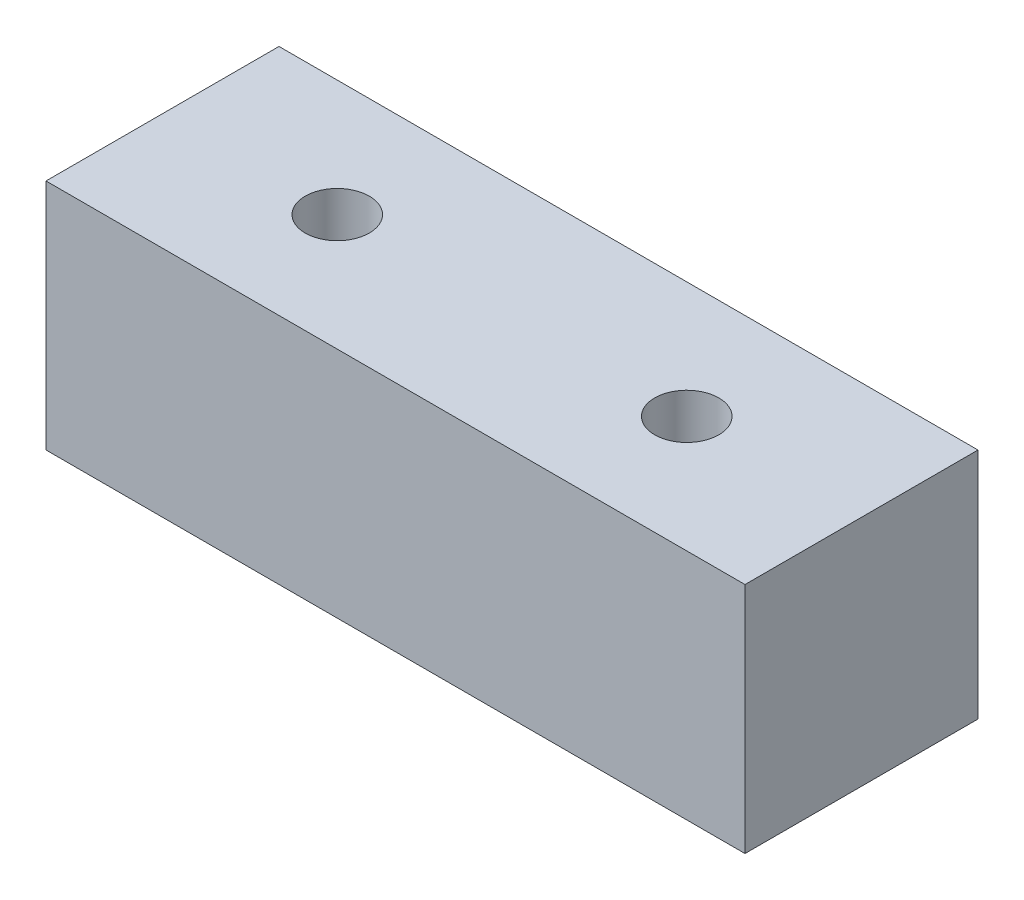
ISO-10303-21;
HEADER;
FILE_DESCRIPTION(('STEP AP214'),'2;1');
FILE_NAME('part.step','',(''),(''),'','','');
FILE_SCHEMA(('AUTOMOTIVE_DESIGN { 1 0 10303 214 1 1 1 1 }'));
ENDSEC;
DATA;
#1=APPLICATION_CONTEXT('core data for automotive mechanical design processes');
#2=APPLICATION_PROTOCOL_DEFINITION('international standard','automotive_design',2000,#1);
#3=PRODUCT_CONTEXT('',#1,'mechanical');
#4=PRODUCT('Part','Part','',(#3));
#5=PRODUCT_RELATED_PRODUCT_CATEGORY('part','',(#4));
#6=PRODUCT_DEFINITION_FORMATION('','',#4);
#7=PRODUCT_DEFINITION_CONTEXT('part definition',#1,'design');
#8=PRODUCT_DEFINITION('design','',#6,#7);
#9=PRODUCT_DEFINITION_SHAPE('','',#8);
#10=(LENGTH_UNIT() NAMED_UNIT(*) SI_UNIT(.MILLI.,.METRE.));
#11=(NAMED_UNIT(*) PLANE_ANGLE_UNIT() SI_UNIT($,.RADIAN.));
#12=(NAMED_UNIT(*) SI_UNIT($,.STERADIAN.) SOLID_ANGLE_UNIT());
#13=UNCERTAINTY_MEASURE_WITH_UNIT(LENGTH_MEASURE(1.E-05),#10,'distance_accuracy_value','');
#14=(GEOMETRIC_REPRESENTATION_CONTEXT(3) GLOBAL_UNCERTAINTY_ASSIGNED_CONTEXT((#13)) GLOBAL_UNIT_ASSIGNED_CONTEXT((#10,
#11,#12)) REPRESENTATION_CONTEXT('',''));
#15=CARTESIAN_POINT('',(0.,0.,0.));
#16=DIRECTION('',(0.,0.,1.));
#17=DIRECTION('',(1.,0.,0.));
#18=AXIS2_PLACEMENT_3D('',#15,#16,#17);
#19=CARTESIAN_POINT('',(30.,10.,10.));
#20=DIRECTION('',(0.,-1.,0.));
#21=DIRECTION('',(0.,0.,-1.));
#22=AXIS2_PLACEMENT_3D('',#19,#20,#21);
#23=PLANE('',#22);
#24=DIRECTION('',(0.,0.,1.));
#25=VECTOR('',#24,1.);
#26=CARTESIAN_POINT('',(-30.,10.,10.));
#27=LINE('',#26,#25);
#28=CARTESIAN_POINT('',(-30.,10.,-10.));
#29=VERTEX_POINT('',#28);
#30=CARTESIAN_POINT('',(-30.,10.,10.));
#31=VERTEX_POINT('',#30);
#32=EDGE_CURVE('E105',#29,#31,#27,.T.);
#33=ORIENTED_EDGE('',*,*,#32,.T.);
#34=DIRECTION('',(-1.,0.,0.));
#35=VECTOR('',#34,1.);
#36=CARTESIAN_POINT('',(30.,10.,10.));
#37=LINE('',#36,#35);
#38=CARTESIAN_POINT('',(30.,10.,10.));
#39=VERTEX_POINT('',#38);
#40=EDGE_CURVE('E58',#39,#31,#37,.T.);
#41=ORIENTED_EDGE('',*,*,#40,.F.);
#42=DIRECTION('',(0.,0.,1.));
#43=VECTOR('',#42,1.);
#44=CARTESIAN_POINT('',(30.,10.,10.));
#45=LINE('',#44,#43);
#46=CARTESIAN_POINT('',(30.,10.,-10.));
#47=VERTEX_POINT('',#46);
#48=EDGE_CURVE('E96',#47,#39,#45,.T.);
#49=ORIENTED_EDGE('',*,*,#48,.F.);
#50=DIRECTION('',(-1.,0.,0.));
#51=VECTOR('',#50,1.);
#52=CARTESIAN_POINT('',(30.,10.,-10.));
#53=LINE('',#52,#51);
#54=EDGE_CURVE('E13',#47,#29,#53,.T.);
#55=ORIENTED_EDGE('',*,*,#54,.T.);
#56=EDGE_LOOP('',(#33,#41,#49,#55));
#57=FACE_BOUND('',#56,.T.);
#58=CARTESIAN_POINT('',(15.,10.,0.));
#59=DIRECTION('',(0.,1.,0.));
#60=DIRECTION('',(0.,0.,1.));
#61=AXIS2_PLACEMENT_3D('',#58,#59,#60);
#62=CIRCLE('',#61,2.75);
#63=CARTESIAN_POINT('',(15.,10.,2.75));
#64=VERTEX_POINT('',#63);
#65=EDGE_CURVE('E128',#64,#64,#62,.T.);
#66=ORIENTED_EDGE('',*,*,#65,.F.);
#67=EDGE_LOOP('',(#66));
#68=FACE_BOUND('',#67,.T.);
#69=CARTESIAN_POINT('',(-15.,10.,0.));
#70=DIRECTION('',(0.,-1.,0.));
#71=DIRECTION('',(0.,0.,1.));
#72=AXIS2_PLACEMENT_3D('',#69,#70,#71);
#73=CIRCLE('',#72,2.75);
#74=CARTESIAN_POINT('',(-15.,10.,2.75));
#75=VERTEX_POINT('',#74);
#76=EDGE_CURVE('E134',#75,#75,#73,.T.);
#77=ORIENTED_EDGE('',*,*,#76,.T.);
#78=EDGE_LOOP('',(#77));
#79=FACE_BOUND('',#78,.T.);
#80=ADVANCED_FACE('F49',(#57,#68,#79),#23,.F.);
#81=CARTESIAN_POINT('',(30.,-10.,10.));
#82=DIRECTION('',(0.,1.,0.));
#83=DIRECTION('',(0.,0.,1.));
#84=AXIS2_PLACEMENT_3D('',#81,#82,#83);
#85=PLANE('',#84);
#86=DIRECTION('',(0.,0.,-1.));
#87=VECTOR('',#86,1.);
#88=CARTESIAN_POINT('',(-30.,-10.,10.));
#89=LINE('',#88,#87);
#90=CARTESIAN_POINT('',(-30.,-10.,10.));
#91=VERTEX_POINT('',#90);
#92=CARTESIAN_POINT('',(-30.,-10.,-10.));
#93=VERTEX_POINT('',#92);
#94=EDGE_CURVE('E89',#91,#93,#89,.T.);
#95=ORIENTED_EDGE('',*,*,#94,.T.);
#96=DIRECTION('',(-1.,0.,0.));
#97=VECTOR('',#96,1.);
#98=CARTESIAN_POINT('',(30.,-10.,-10.));
#99=LINE('',#98,#97);
#100=CARTESIAN_POINT('',(30.,-10.,-10.));
#101=VERTEX_POINT('',#100);
#102=EDGE_CURVE('E109',#101,#93,#99,.T.);
#103=ORIENTED_EDGE('',*,*,#102,.F.);
#104=DIRECTION('',(0.,0.,-1.));
#105=VECTOR('',#104,1.);
#106=CARTESIAN_POINT('',(30.,-10.,10.));
#107=LINE('',#106,#105);
#108=CARTESIAN_POINT('',(30.,-10.,10.));
#109=VERTEX_POINT('',#108);
#110=EDGE_CURVE('E66',#109,#101,#107,.T.);
#111=ORIENTED_EDGE('',*,*,#110,.F.);
#112=DIRECTION('',(-1.,0.,0.));
#113=VECTOR('',#112,1.);
#114=CARTESIAN_POINT('',(30.,-10.,10.));
#115=LINE('',#114,#113);
#116=EDGE_CURVE('E106',#109,#91,#115,.T.);
#117=ORIENTED_EDGE('',*,*,#116,.T.);
#118=EDGE_LOOP('',(#95,#103,#111,#117));
#119=FACE_BOUND('',#118,.T.);
#120=CARTESIAN_POINT('',(15.,-10.,0.));
#121=DIRECTION('',(0.,1.,0.));
#122=DIRECTION('',(0.,0.,1.));
#123=AXIS2_PLACEMENT_3D('',#120,#121,#122);
#124=CIRCLE('',#123,2.75);
#125=CARTESIAN_POINT('',(15.,-10.,2.75));
#126=VERTEX_POINT('',#125);
#127=EDGE_CURVE('E116',#126,#126,#124,.T.);
#128=ORIENTED_EDGE('',*,*,#127,.T.);
#129=EDGE_LOOP('',(#128));
#130=FACE_BOUND('',#129,.T.);
#131=CARTESIAN_POINT('',(-15.,-10.,0.));
#132=DIRECTION('',(0.,-1.,0.));
#133=DIRECTION('',(0.,0.,1.));
#134=AXIS2_PLACEMENT_3D('',#131,#132,#133);
#135=CIRCLE('',#134,2.75);
#136=CARTESIAN_POINT('',(-15.,-10.,2.75));
#137=VERTEX_POINT('',#136);
#138=EDGE_CURVE('E131',#137,#137,#135,.T.);
#139=ORIENTED_EDGE('',*,*,#138,.F.);
#140=EDGE_LOOP('',(#139));
#141=FACE_BOUND('',#140,.T.);
#142=ADVANCED_FACE('F121',(#119,#130,#141),#85,.F.);
#143=CARTESIAN_POINT('',(30.,-10.,-10.));
#144=DIRECTION('',(0.,0.,1.));
#145=DIRECTION('',(1.,0.,0.));
#146=AXIS2_PLACEMENT_3D('',#143,#144,#145);
#147=PLANE('',#146);
#148=DIRECTION('',(0.,1.,0.));
#149=VECTOR('',#148,1.);
#150=CARTESIAN_POINT('',(-30.,-10.,-10.));
#151=LINE('',#150,#149);
#152=EDGE_CURVE('E113',#93,#29,#151,.T.);
#153=ORIENTED_EDGE('',*,*,#152,.T.);
#154=ORIENTED_EDGE('',*,*,#54,.F.);
#155=DIRECTION('',(0.,1.,0.));
#156=VECTOR('',#155,1.);
#157=CARTESIAN_POINT('',(30.,-10.,-10.));
#158=LINE('',#157,#156);
#159=EDGE_CURVE('E101',#101,#47,#158,.T.);
#160=ORIENTED_EDGE('',*,*,#159,.F.);
#161=ORIENTED_EDGE('',*,*,#102,.T.);
#162=EDGE_LOOP('',(#153,#154,#160,#161));
#163=FACE_BOUND('',#162,.T.);
#164=ADVANCED_FACE('F51',(#163),#147,.F.);
#165=CARTESIAN_POINT('',(30.,-10.,10.));
#166=DIRECTION('',(0.,0.,-1.));
#167=DIRECTION('',(-1.,0.,0.));
#168=AXIS2_PLACEMENT_3D('',#165,#166,#167);
#169=PLANE('',#168);
#170=DIRECTION('',(0.,-1.,0.));
#171=VECTOR('',#170,1.);
#172=CARTESIAN_POINT('',(-30.,-10.,10.));
#173=LINE('',#172,#171);
#174=EDGE_CURVE('E83',#31,#91,#173,.T.);
#175=ORIENTED_EDGE('',*,*,#174,.T.);
#176=ORIENTED_EDGE('',*,*,#116,.F.);
#177=DIRECTION('',(0.,-1.,0.));
#178=VECTOR('',#177,1.);
#179=CARTESIAN_POINT('',(30.,-10.,10.));
#180=LINE('',#179,#178);
#181=EDGE_CURVE('E99',#39,#109,#180,.T.);
#182=ORIENTED_EDGE('',*,*,#181,.F.);
#183=ORIENTED_EDGE('',*,*,#40,.T.);
#184=EDGE_LOOP('',(#175,#176,#182,#183));
#185=FACE_BOUND('',#184,.T.);
#186=ADVANCED_FACE('F107',(#185),#169,.F.);
#187=CARTESIAN_POINT('',(30.,0.,0.));
#188=DIRECTION('',(-1.,0.,0.));
#189=DIRECTION('',(0.,0.,1.));
#190=AXIS2_PLACEMENT_3D('',#187,#188,#189);
#191=PLANE('',#190);
#192=ORIENTED_EDGE('',*,*,#159,.T.);
#193=ORIENTED_EDGE('',*,*,#48,.T.);
#194=ORIENTED_EDGE('',*,*,#181,.T.);
#195=ORIENTED_EDGE('',*,*,#110,.T.);
#196=EDGE_LOOP('',(#192,#193,#194,#195));
#197=FACE_BOUND('',#196,.T.);
#198=ADVANCED_FACE('F97',(#197),#191,.F.);
#199=CARTESIAN_POINT('',(-30.,0.,0.));
#200=DIRECTION('',(-1.,0.,0.));
#201=DIRECTION('',(0.,0.,1.));
#202=AXIS2_PLACEMENT_3D('',#199,#200,#201);
#203=PLANE('',#202);
#204=ORIENTED_EDGE('',*,*,#152,.F.);
#205=ORIENTED_EDGE('',*,*,#94,.F.);
#206=ORIENTED_EDGE('',*,*,#174,.F.);
#207=ORIENTED_EDGE('',*,*,#32,.F.);
#208=EDGE_LOOP('',(#204,#205,#206,#207));
#209=FACE_BOUND('',#208,.T.);
#210=ADVANCED_FACE('F125',(#209),#203,.T.);
#211=CARTESIAN_POINT('',(15.,-10.,0.));
#212=DIRECTION('',(0.,1.,0.));
#213=DIRECTION('',(0.,0.,1.));
#214=AXIS2_PLACEMENT_3D('',#211,#212,#213);
#215=CYLINDRICAL_SURFACE('',#214,2.75);
#216=ORIENTED_EDGE('',*,*,#127,.F.);
#217=EDGE_LOOP('',(#216));
#218=FACE_BOUND('',#217,.T.);
#219=ORIENTED_EDGE('',*,*,#65,.T.);
#220=EDGE_LOOP('',(#219));
#221=FACE_BOUND('',#220,.T.);
#222=ADVANCED_FACE('F159',(#218,#221),#215,.F.);
#223=CARTESIAN_POINT('',(-15.,-10.,0.));
#224=DIRECTION('',(0.,1.,0.));
#225=DIRECTION('',(0.,0.,1.));
#226=AXIS2_PLACEMENT_3D('',#223,#224,#225);
#227=CYLINDRICAL_SURFACE('',#226,2.75);
#228=ORIENTED_EDGE('',*,*,#138,.T.);
#229=EDGE_LOOP('',(#228));
#230=FACE_BOUND('',#229,.T.);
#231=ORIENTED_EDGE('',*,*,#76,.F.);
#232=EDGE_LOOP('',(#231));
#233=FACE_BOUND('',#232,.T.);
#234=ADVANCED_FACE('F140',(#230,#233),#227,.F.);
#235=CLOSED_SHELL('',(#80,#142,#164,#186,#198,#210,#222,#234));
#236=MANIFOLD_SOLID_BREP('B2',#235);
#237=ADVANCED_BREP_SHAPE_REPRESENTATION('',(#18,#236),#14);
#238=SHAPE_DEFINITION_REPRESENTATION(#9,#237);
ENDSEC;
END-ISO-10303-21;
